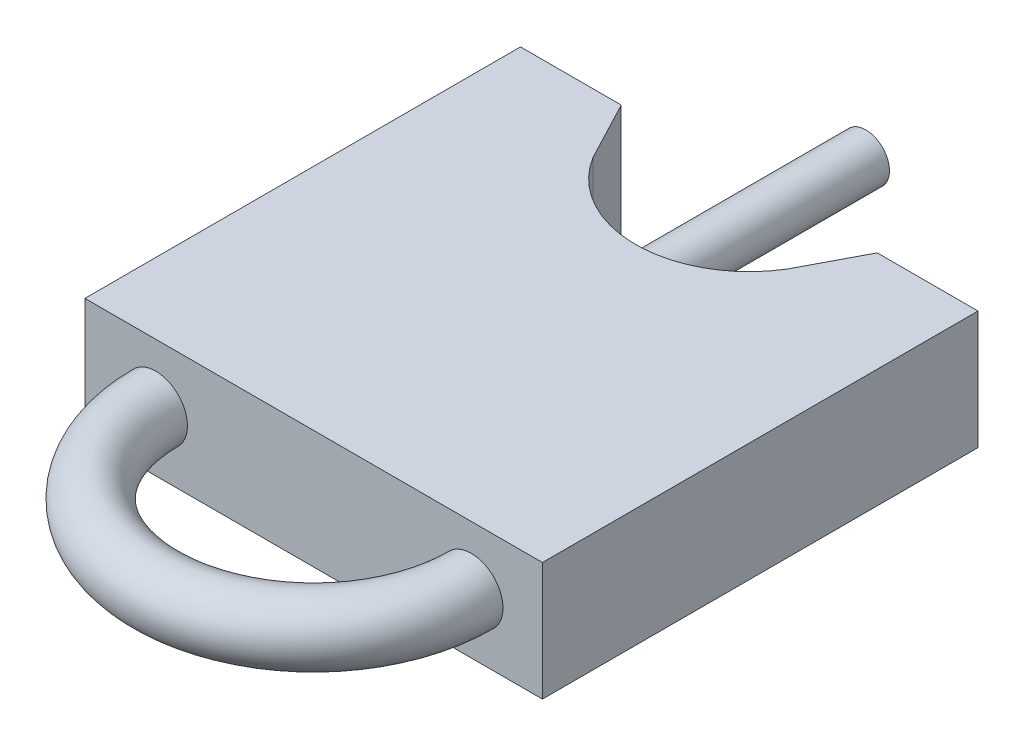
ISO-10303-21;
HEADER;
FILE_DESCRIPTION(('STEP AP214'),'2;1');
FILE_NAME('part.step','',(''),(''),'','','');
FILE_SCHEMA(('AUTOMOTIVE_DESIGN { 1 0 10303 214 1 1 1 1 }'));
ENDSEC;
DATA;
#1=APPLICATION_CONTEXT('core data for automotive mechanical design processes');
#2=APPLICATION_PROTOCOL_DEFINITION('international standard','automotive_design',2000,#1);
#3=PRODUCT_CONTEXT('',#1,'mechanical');
#4=PRODUCT('Part','Part','',(#3));
#5=PRODUCT_RELATED_PRODUCT_CATEGORY('part','',(#4));
#6=PRODUCT_DEFINITION_FORMATION('','',#4);
#7=PRODUCT_DEFINITION_CONTEXT('part definition',#1,'design');
#8=PRODUCT_DEFINITION('design','',#6,#7);
#9=PRODUCT_DEFINITION_SHAPE('','',#8);
#10=(LENGTH_UNIT() NAMED_UNIT(*) SI_UNIT(.MILLI.,.METRE.));
#11=(NAMED_UNIT(*) PLANE_ANGLE_UNIT() SI_UNIT($,.RADIAN.));
#12=(NAMED_UNIT(*) SI_UNIT($,.STERADIAN.) SOLID_ANGLE_UNIT());
#13=UNCERTAINTY_MEASURE_WITH_UNIT(LENGTH_MEASURE(1.E-05),#10,'distance_accuracy_value','');
#14=(GEOMETRIC_REPRESENTATION_CONTEXT(3) GLOBAL_UNCERTAINTY_ASSIGNED_CONTEXT((#13)) GLOBAL_UNIT_ASSIGNED_CONTEXT((#10,
#11,#12)) REPRESENTATION_CONTEXT('',''));
#15=CARTESIAN_POINT('',(0.,0.,0.));
#16=DIRECTION('',(0.,0.,1.));
#17=DIRECTION('',(1.,0.,0.));
#18=AXIS2_PLACEMENT_3D('',#15,#16,#17);
#19=CARTESIAN_POINT('',(14.5,0.,15.));
#20=DIRECTION('',(-1.,0.,0.));
#21=DIRECTION('',(0.,-1.,0.));
#22=AXIS2_PLACEMENT_3D('',#19,#20,#21);
#23=PLANE('',#22);
#24=DIRECTION('',(0.,0.,-1.));
#25=VECTOR('',#24,1.);
#26=CARTESIAN_POINT('',(14.5,-5.,15.));
#27=LINE('',#26,#25);
#28=CARTESIAN_POINT('',(14.5,-5.,15.));
#29=VERTEX_POINT('',#28);
#30=CARTESIAN_POINT('',(14.5,-5.,-12.61));
#31=VERTEX_POINT('',#30);
#32=EDGE_CURVE('E169',#29,#31,#27,.T.);
#33=ORIENTED_EDGE('',*,*,#32,.T.);
#34=DIRECTION('',(0.,1.,0.));
#35=VECTOR('',#34,1.);
#36=CARTESIAN_POINT('',(14.5,-36.6229679189035,-12.61));
#37=LINE('',#36,#35);
#38=CARTESIAN_POINT('',(14.5,2.5,-12.61));
#39=VERTEX_POINT('',#38);
#40=EDGE_CURVE('E143',#31,#39,#37,.T.);
#41=ORIENTED_EDGE('',*,*,#40,.T.);
#42=DIRECTION('',(0.,0.,-1.));
#43=VECTOR('',#42,1.);
#44=CARTESIAN_POINT('',(14.5,2.5,15.));
#45=LINE('',#44,#43);
#46=CARTESIAN_POINT('',(14.5,2.5,15.));
#47=VERTEX_POINT('',#46);
#48=EDGE_CURVE('E136',#47,#39,#45,.T.);
#49=ORIENTED_EDGE('',*,*,#48,.F.);
#50=DIRECTION('',(0.,1.,0.));
#51=VECTOR('',#50,1.);
#52=CARTESIAN_POINT('',(14.5,0.,15.));
#53=LINE('',#52,#51);
#54=EDGE_CURVE('E161',#29,#47,#53,.T.);
#55=ORIENTED_EDGE('',*,*,#54,.F.);
#56=EDGE_LOOP('',(#33,#41,#49,#55));
#57=FACE_BOUND('',#56,.T.);
#58=ADVANCED_FACE('F60',(#57),#23,.F.);
#59=CARTESIAN_POINT('',(0.,2.5,15.));
#60=DIRECTION('',(0.,1.,0.));
#61=DIRECTION('',(-1.,0.,0.));
#62=AXIS2_PLACEMENT_3D('',#59,#60,#61);
#63=PLANE('',#62);
#64=DIRECTION('',(1.,0.,0.));
#65=VECTOR('',#64,1.);
#66=CARTESIAN_POINT('',(0.,2.5,-12.61));
#67=LINE('',#66,#65);
#68=CARTESIAN_POINT('',(8.11481498177935,2.5,-12.61));
#69=VERTEX_POINT('',#68);
#70=EDGE_CURVE('E144',#69,#39,#67,.T.);
#71=ORIENTED_EDGE('',*,*,#70,.F.);
#72=DIRECTION('',(0.465219407707572,0.,-0.885195403677751));
#73=VECTOR('',#72,1.);
#74=CARTESIAN_POINT('',(-5.01154344712309,2.5,12.3661552415605));
#75=LINE('',#74,#73);
#76=CARTESIAN_POINT('',(6.12982564685899,2.5,-8.83306506024928));
#77=VERTEX_POINT('',#76);
#78=EDGE_CURVE('E241',#69,#77,#75,.F.);
#79=ORIENTED_EDGE('',*,*,#78,.T.);
#80=CARTESIAN_POINT('',(0.,2.5,-12.61));
#81=DIRECTION('',(0.,1.,0.));
#82=DIRECTION('',(-1.,0.,0.));
#83=AXIS2_PLACEMENT_3D('',#80,#81,#82);
#84=CIRCLE('',#83,7.2);
#85=CARTESIAN_POINT('',(-6.12982564685899,2.5,-8.83306506024929));
#86=VERTEX_POINT('',#85);
#87=EDGE_CURVE('E150',#86,#77,#84,.T.);
#88=ORIENTED_EDGE('',*,*,#87,.F.);
#89=DIRECTION('',(0.465219407707571,0.,0.885195403677751));
#90=VECTOR('',#89,1.);
#91=CARTESIAN_POINT('',(5.01154344712308,2.5,12.3661552415605));
#92=LINE('',#91,#90);
#93=CARTESIAN_POINT('',(-8.11481498177935,2.5,-12.61));
#94=VERTEX_POINT('',#93);
#95=EDGE_CURVE('E149',#86,#94,#92,.F.);
#96=ORIENTED_EDGE('',*,*,#95,.T.);
#97=DIRECTION('',(1.,0.,0.));
#98=VECTOR('',#97,1.);
#99=CARTESIAN_POINT('',(0.,2.5,-12.61));
#100=LINE('',#99,#98);
#101=CARTESIAN_POINT('',(-14.5,2.5,-12.61));
#102=VERTEX_POINT('',#101);
#103=EDGE_CURVE('E140',#102,#94,#100,.T.);
#104=ORIENTED_EDGE('',*,*,#103,.F.);
#105=DIRECTION('',(0.,0.,-1.));
#106=VECTOR('',#105,1.);
#107=CARTESIAN_POINT('',(-14.5,2.5,15.));
#108=LINE('',#107,#106);
#109=CARTESIAN_POINT('',(-14.5,2.5,15.));
#110=VERTEX_POINT('',#109);
#111=EDGE_CURVE('E126',#110,#102,#108,.T.);
#112=ORIENTED_EDGE('',*,*,#111,.F.);
#113=DIRECTION('',(1.,0.,0.));
#114=VECTOR('',#113,1.);
#115=CARTESIAN_POINT('',(0.,2.5,15.));
#116=LINE('',#115,#114);
#117=EDGE_CURVE('E163',#110,#47,#116,.T.);
#118=ORIENTED_EDGE('',*,*,#117,.T.);
#119=ORIENTED_EDGE('',*,*,#48,.T.);
#120=EDGE_LOOP('',(#71,#79,#88,#96,#104,#112,#118,#119));
#121=FACE_BOUND('',#120,.T.);
#122=ADVANCED_FACE('F147',(#121),#63,.T.);
#123=CARTESIAN_POINT('',(-14.5,0.,15.));
#124=DIRECTION('',(-1.,0.,0.));
#125=DIRECTION('',(0.,0.,1.));
#126=AXIS2_PLACEMENT_3D('',#123,#124,#125);
#127=PLANE('',#126);
#128=ORIENTED_EDGE('',*,*,#111,.T.);
#129=DIRECTION('',(0.,1.,0.));
#130=VECTOR('',#129,1.);
#131=CARTESIAN_POINT('',(-14.5,-36.6229679189035,-12.61));
#132=LINE('',#131,#130);
#133=CARTESIAN_POINT('',(-14.5,-5.,-12.61));
#134=VERTEX_POINT('',#133);
#135=EDGE_CURVE('E129',#134,#102,#132,.T.);
#136=ORIENTED_EDGE('',*,*,#135,.F.);
#137=DIRECTION('',(0.,0.,-1.));
#138=VECTOR('',#137,1.);
#139=CARTESIAN_POINT('',(-14.5,-5.,15.));
#140=LINE('',#139,#138);
#141=CARTESIAN_POINT('',(-14.5,-5.,15.));
#142=VERTEX_POINT('',#141);
#143=EDGE_CURVE('E137',#142,#134,#140,.T.);
#144=ORIENTED_EDGE('',*,*,#143,.F.);
#145=DIRECTION('',(0.,1.,0.));
#146=VECTOR('',#145,1.);
#147=CARTESIAN_POINT('',(-14.5,0.,15.));
#148=LINE('',#147,#146);
#149=EDGE_CURVE('E131',#142,#110,#148,.T.);
#150=ORIENTED_EDGE('',*,*,#149,.T.);
#151=EDGE_LOOP('',(#128,#136,#144,#150));
#152=FACE_BOUND('',#151,.T.);
#153=ADVANCED_FACE('F128',(#152),#127,.T.);
#154=CARTESIAN_POINT('',(0.,-5.,15.));
#155=DIRECTION('',(0.,1.,0.));
#156=DIRECTION('',(-1.,0.,0.));
#157=AXIS2_PLACEMENT_3D('',#154,#155,#156);
#158=PLANE('',#157);
#159=CARTESIAN_POINT('',(0.,-5.,-12.61));
#160=DIRECTION('',(0.,1.,0.));
#161=DIRECTION('',(-1.,0.,0.));
#162=AXIS2_PLACEMENT_3D('',#159,#160,#161);
#163=CIRCLE('',#162,7.2);
#164=CARTESIAN_POINT('',(6.12982564685899,-5.,-8.83306506024928));
#165=VERTEX_POINT('',#164);
#166=CARTESIAN_POINT('',(-6.12982564685899,-5.,-8.83306506024929));
#167=VERTEX_POINT('',#166);
#168=EDGE_CURVE('E191',#165,#167,#163,.F.);
#169=ORIENTED_EDGE('',*,*,#168,.F.);
#170=DIRECTION('',(-0.465219407707572,0.,0.885195403677751));
#171=VECTOR('',#170,1.);
#172=CARTESIAN_POINT('',(8.11481498177936,-5.,-12.61));
#173=LINE('',#172,#171);
#174=CARTESIAN_POINT('',(8.11481498177935,-5.,-12.61));
#175=VERTEX_POINT('',#174);
#176=EDGE_CURVE('E69',#165,#175,#173,.F.);
#177=ORIENTED_EDGE('',*,*,#176,.T.);
#178=DIRECTION('',(-1.,0.,0.));
#179=VECTOR('',#178,1.);
#180=CARTESIAN_POINT('',(0.,-5.,-12.61));
#181=LINE('',#180,#179);
#182=EDGE_CURVE('E160',#31,#175,#181,.T.);
#183=ORIENTED_EDGE('',*,*,#182,.F.);
#184=ORIENTED_EDGE('',*,*,#32,.F.);
#185=DIRECTION('',(1.,0.,0.));
#186=VECTOR('',#185,1.);
#187=CARTESIAN_POINT('',(0.,-5.,15.));
#188=LINE('',#187,#186);
#189=EDGE_CURVE('E167',#142,#29,#188,.T.);
#190=ORIENTED_EDGE('',*,*,#189,.F.);
#191=ORIENTED_EDGE('',*,*,#143,.T.);
#192=DIRECTION('',(-1.,0.,0.));
#193=VECTOR('',#192,1.);
#194=CARTESIAN_POINT('',(0.,-5.,-12.61));
#195=LINE('',#194,#193);
#196=CARTESIAN_POINT('',(-8.11481498177935,-5.,-12.61));
#197=VERTEX_POINT('',#196);
#198=EDGE_CURVE('E141',#197,#134,#195,.T.);
#199=ORIENTED_EDGE('',*,*,#198,.F.);
#200=DIRECTION('',(-0.465219407707571,0.,-0.885195403677751));
#201=VECTOR('',#200,1.);
#202=CARTESIAN_POINT('',(-6.12982564685899,-5.,-8.83306506024928));
#203=LINE('',#202,#201);
#204=EDGE_CURVE('E81',#197,#167,#203,.F.);
#205=ORIENTED_EDGE('',*,*,#204,.T.);
#206=EDGE_LOOP('',(#169,#177,#183,#184,#190,#191,#199,#205));
#207=FACE_BOUND('',#206,.T.);
#208=ADVANCED_FACE('F212',(#207),#158,.F.);
#209=CARTESIAN_POINT('',(0.,0.,15.));
#210=DIRECTION('',(0.,0.,1.));
#211=DIRECTION('',(1.,0.,0.));
#212=AXIS2_PLACEMENT_3D('',#209,#210,#211);
#213=PLANE('',#212);
#214=CARTESIAN_POINT('',(10.,-1.25,15.));
#215=DIRECTION('',(0.,0.,1.));
#216=DIRECTION('',(1.,0.,0.));
#217=AXIS2_PLACEMENT_3D('',#214,#215,#216);
#218=CIRCLE('',#217,2.);
#219=CARTESIAN_POINT('',(12.,-1.25,15.));
#220=VERTEX_POINT('',#219);
#221=EDGE_CURVE('E180',#220,#220,#218,.T.);
#222=ORIENTED_EDGE('',*,*,#221,.F.);
#223=EDGE_LOOP('',(#222));
#224=FACE_BOUND('',#223,.T.);
#225=CARTESIAN_POINT('',(-10.,-1.25,15.));
#226=DIRECTION('',(0.,0.,1.));
#227=DIRECTION('',(1.,0.,0.));
#228=AXIS2_PLACEMENT_3D('',#225,#226,#227);
#229=CIRCLE('',#228,2.);
#230=CARTESIAN_POINT('',(-12.,-1.25,15.));
#231=VERTEX_POINT('',#230);
#232=EDGE_CURVE('E177',#231,#231,#229,.T.);
#233=ORIENTED_EDGE('',*,*,#232,.F.);
#234=EDGE_LOOP('',(#233));
#235=FACE_BOUND('',#234,.T.);
#236=ORIENTED_EDGE('',*,*,#54,.T.);
#237=ORIENTED_EDGE('',*,*,#117,.F.);
#238=ORIENTED_EDGE('',*,*,#149,.F.);
#239=ORIENTED_EDGE('',*,*,#189,.T.);
#240=EDGE_LOOP('',(#236,#237,#238,#239));
#241=FACE_BOUND('',#240,.T.);
#242=ADVANCED_FACE('F208',(#224,#235,#241),#213,.T.);
#243=CARTESIAN_POINT('',(0.,-1.25,15.));
#244=DIRECTION('',(0.,1.,0.));
#245=DIRECTION('',(-1.,0.,0.));
#246=AXIS2_PLACEMENT_3D('',#243,#244,#245);
#247=TOROIDAL_SURFACE('',#246,10.,2.);
#248=CARTESIAN_POINT('',(0.,-1.25,15.));
#249=DIRECTION('',(0.,1.,0.));
#250=DIRECTION('',(-1.,0.,0.));
#251=AXIS2_PLACEMENT_3D('',#248,#249,#250);
#252=CIRCLE('',#251,12.);
#253=EDGE_CURVE('',#231,#220,#252,.T.);
#254=ORIENTED_EDGE('',*,*,#232,.T.);
#255=ORIENTED_EDGE('',*,*,#221,.T.);
#256=ORIENTED_EDGE('',*,*,#253,.T.);
#257=ORIENTED_EDGE('',*,*,#253,.F.);
#258=EDGE_LOOP('',(#254,#256,#255,#257));
#259=FACE_BOUND('',#258,.T.);
#260=ADVANCED_FACE('F205',(#259),#247,.T.);
#261=CARTESIAN_POINT('',(0.,-36.6229679189035,-12.61));
#262=DIRECTION('',(0.,0.,1.));
#263=DIRECTION('',(1.,0.,0.));
#264=AXIS2_PLACEMENT_3D('',#261,#262,#263);
#265=PLANE('',#264);
#266=ORIENTED_EDGE('',*,*,#103,.T.);
#267=DIRECTION('',(0.,-1.,0.));
#268=VECTOR('',#267,1.);
#269=CARTESIAN_POINT('',(-8.11481498177935,-36.6229679189035,-12.61));
#270=LINE('',#269,#268);
#271=EDGE_CURVE('E12',#94,#197,#270,.T.);
#272=ORIENTED_EDGE('',*,*,#271,.T.);
#273=ORIENTED_EDGE('',*,*,#198,.T.);
#274=ORIENTED_EDGE('',*,*,#135,.T.);
#275=EDGE_LOOP('',(#266,#272,#273,#274));
#276=FACE_BOUND('',#275,.T.);
#277=ADVANCED_FACE('F139',(#276),#265,.F.);
#278=CARTESIAN_POINT('',(0.,-36.6229679189035,-12.61));
#279=DIRECTION('',(0.,0.,1.));
#280=DIRECTION('',(1.,0.,0.));
#281=AXIS2_PLACEMENT_3D('',#278,#279,#280);
#282=PLANE('',#281);
#283=ORIENTED_EDGE('',*,*,#182,.T.);
#284=DIRECTION('',(0.,1.,0.));
#285=VECTOR('',#284,1.);
#286=CARTESIAN_POINT('',(8.11481498177935,-36.6229679189035,-12.61));
#287=LINE('',#286,#285);
#288=EDGE_CURVE('E183',#175,#69,#287,.T.);
#289=ORIENTED_EDGE('',*,*,#288,.T.);
#290=ORIENTED_EDGE('',*,*,#70,.T.);
#291=ORIENTED_EDGE('',*,*,#40,.F.);
#292=EDGE_LOOP('',(#283,#289,#290,#291));
#293=FACE_BOUND('',#292,.T.);
#294=ADVANCED_FACE('F202',(#293),#282,.F.);
#295=CARTESIAN_POINT('',(0.,-36.6229679189035,-12.61));
#296=DIRECTION('',(0.,1.,0.));
#297=DIRECTION('',(-1.,0.,0.));
#298=AXIS2_PLACEMENT_3D('',#295,#296,#297);
#299=CYLINDRICAL_SURFACE('',#298,7.2);
#300=CARTESIAN_POINT('',(1.5,0.,-5.5679832434167));
#301=CARTESIAN_POINT('',(1.4999970105312,-0.0832687381812369,-5.56798156943626));
#302=CARTESIAN_POINT('',(1.49304275320737,-0.166574366418262,-5.56649024890548));
#303=CARTESIAN_POINT('',(1.46543579080535,-0.330823580780698,-5.56069581301843));
#304=CARTESIAN_POINT('',(1.44477258528411,-0.411765306607708,-5.55639054233934));
#305=CARTESIAN_POINT('',(1.39042077008676,-0.568886847401842,-5.54547648445684));
#306=CARTESIAN_POINT('',(1.35674569498719,-0.645071515190165,-5.53887009151666));
#307=CARTESIAN_POINT('',(1.27736386322079,-0.790709399574722,-5.52410102397111));
#308=CARTESIAN_POINT('',(1.23165759282984,-0.860162888076021,-5.51593841226853));
#309=CARTESIAN_POINT('',(1.1287636793593,-0.991434450184156,-5.49883678406239));
#310=CARTESIAN_POINT('',(1.0714266658436,-1.05313427235176,-5.48988862752353));
#311=CARTESIAN_POINT('',(0.947221468656765,-1.16611328237773,-5.4723043983691));
#312=CARTESIAN_POINT('',(0.880352586547204,-1.21739170594973,-5.46366834868102));
#313=CARTESIAN_POINT('',(0.738194463599507,-1.30853506569943,-5.44758237857382));
#314=CARTESIAN_POINT('',(0.66283131384593,-1.34828703175591,-5.44014449642509));
#315=CARTESIAN_POINT('',(0.506314261208064,-1.41451926343174,-5.42739583188037));
#316=CARTESIAN_POINT('',(0.42516094794071,-1.44100087818424,-5.42208483326533));
#317=CARTESIAN_POINT('',(0.260595485040603,-1.47957091334097,-5.41425292129386));
#318=CARTESIAN_POINT('',(0.177232057099629,-1.4918592206342,-5.41169329648089));
#319=CARTESIAN_POINT('',(0.00959021860742903,-1.50231803490842,-5.40951864903265));
#320=CARTESIAN_POINT('',(-0.0746880956842065,-1.50049001303173,-5.40990331955572));
#321=CARTESIAN_POINT('',(-0.240391903439487,-1.48291847885191,-5.41354410291387));
#322=CARTESIAN_POINT('',(-0.321841354471771,-1.46739033725026,-5.41675577252099));
#323=CARTESIAN_POINT('',(-0.480952495547703,-1.42320164960244,-5.42563934921338));
#324=CARTESIAN_POINT('',(-0.558614025013227,-1.39454054735631,-5.43131136049715));
#325=CARTESIAN_POINT('',(-0.708552006461622,-1.3247039374494,-5.44455079211292));
#326=CARTESIAN_POINT('',(-0.780788561977981,-1.28344524694841,-5.45213075049585));
#327=CARTESIAN_POINT('',(-0.917392147812779,-1.1896463965915,-5.46835239471774));
#328=CARTESIAN_POINT('',(-0.981758198179704,-1.13710483415265,-5.4769942125001));
#329=CARTESIAN_POINT('',(-1.1020730439323,-1.02105405013074,-5.49457959720069));
#330=CARTESIAN_POINT('',(-1.15783978499375,-0.957356328021666,-5.50352578028889));
#331=CARTESIAN_POINT('',(-1.25793116688586,-0.821421541206241,-5.52055752821205));
#332=CARTESIAN_POINT('',(-1.30225555283976,-0.74918428633532,-5.52864307387408));
#333=CARTESIAN_POINT('',(-1.37827460566145,-0.597945294205443,-5.54304401909013));
#334=CARTESIAN_POINT('',(-1.40993766587673,-0.518927219167881,-5.5493549772145));
#335=CARTESIAN_POINT('',(-1.45948293046407,-0.356530056756738,-5.55942872307568));
#336=CARTESIAN_POINT('',(-1.47736709858818,-0.273151592630289,-5.56319187391381));
#337=CARTESIAN_POINT('',(-1.49857036640421,-0.106056352417313,-5.56767060113042));
#338=CARTESIAN_POINT('',(-1.50215331501598,-0.0223744985555643,-5.56844137763831));
#339=CARTESIAN_POINT('',(-1.49536432127153,0.144390973848169,-5.56699657577556));
#340=CARTESIAN_POINT('',(-1.48499324229435,0.227474629082801,-5.56478118216852));
#341=CARTESIAN_POINT('',(-1.45081869990581,0.389784619269748,-5.55766554128601));
#342=CARTESIAN_POINT('',(-1.42715809652246,0.469042400614594,-5.55279386460403));
#343=CARTESIAN_POINT('',(-1.36722973033103,0.622468787329923,-5.54093993796256));
#344=CARTESIAN_POINT('',(-1.33096085467376,0.696636942780482,-5.53395750170731));
#345=CARTESIAN_POINT('',(-1.24625517817782,0.838927729459475,-5.51854597675371));
#346=CARTESIAN_POINT('',(-1.19765439282476,0.906950645359403,-5.51009792022012));
#347=CARTESIAN_POINT('',(-1.08988132868386,1.03397189898607,-5.49275819207311));
#348=CARTESIAN_POINT('',(-1.03070786460621,1.09296922348708,-5.48386647080162));
#349=CARTESIAN_POINT('',(-0.902280541012008,1.2012752557166,-5.46646090819916));
#350=CARTESIAN_POINT('',(-0.832874289137463,1.25040491403166,-5.45795590336108));
#351=CARTESIAN_POINT('',(-0.686640122659632,1.33630650250558,-5.44243949473112));
#352=CARTESIAN_POINT('',(-0.609812536172258,1.37307897868494,-5.43542802495018));
#353=CARTESIAN_POINT('',(-0.451370541417504,1.43296641518082,-5.42372622075186));
#354=CARTESIAN_POINT('',(-0.369788053164234,1.45616299865321,-5.41902204236204));
#355=CARTESIAN_POINT('',(-0.203776080604167,1.48849728480972,-5.41240526307728));
#356=CARTESIAN_POINT('',(-0.119346971354035,1.49763683223928,-5.41049229588534));
#357=CARTESIAN_POINT('',(0.0482560121644068,1.50152114645822,-5.40968310331671));
#358=CARTESIAN_POINT('',(0.131423510613506,1.49653427999368,-5.41073063494227));
#359=CARTESIAN_POINT('',(0.295707444448263,1.47290323361648,-5.41560551086633));
#360=CARTESIAN_POINT('',(0.376823910243243,1.45425925631188,-5.41943281392593));
#361=CARTESIAN_POINT('',(0.534518358590463,1.40396664642173,-5.42943447906948));
#362=CARTESIAN_POINT('',(0.611107860005429,1.37235280337627,-5.43560255910933));
#363=CARTESIAN_POINT('',(0.757932680664891,1.2970531227216,-5.44962405582755));
#364=CARTESIAN_POINT('',(0.828167445935414,1.25336623398824,-5.45747761923705));
#365=CARTESIAN_POINT('',(0.961608385557914,1.15426839840803,-5.47418083856337));
#366=CARTESIAN_POINT('',(1.02467116033911,1.09866685433196,-5.48304543636579));
#367=CARTESIAN_POINT('',(1.14066329037646,0.977706598803499,-5.5006865582638));
#368=CARTESIAN_POINT('',(1.19359022588548,0.912345564061881,-5.50946306085558));
#369=CARTESIAN_POINT('',(1.28840942223321,0.772789077079873,-5.52604970028008));
#370=CARTESIAN_POINT('',(1.33016313752393,0.698497906245485,-5.53384711956939));
#371=CARTESIAN_POINT('',(1.40052753510368,0.543809812700081,-5.54743552410325));
#372=CARTESIAN_POINT('',(1.42914979550952,0.463418341856389,-5.55322827576879));
#373=CARTESIAN_POINT('',(1.46707864958233,0.319072462117877,-5.56103194713765));
#374=CARTESIAN_POINT('',(1.47940138806804,0.255924556088334,-5.56362203690094));
#375=CARTESIAN_POINT('',(1.49586305230085,0.128525063374787,-5.56709829679867));
#376=CARTESIAN_POINT('',(1.50000230751289,0.0642735212279467,-5.56798453552968));
#377=CARTESIAN_POINT('',(1.5,0.,-5.5679832434167));
#378=B_SPLINE_CURVE_WITH_KNOTS('',3,(#300,#301,#302,#303,#304,#305,#306,#307,#308,#309,#310,
#311,#312,#313,#314,#315,#316,#317,#318,#319,#320,#321,#322,#323,#324,#325,#326,#327,#328,#329,
#330,#331,#332,#333,#334,#335,#336,#337,#338,#339,#340,#341,#342,#343,#344,#345,#346,#347,#348,
#349,#350,#351,#352,#353,#354,#355,#356,#357,#358,#359,#360,#361,#362,#363,#364,#365,#366,#367,
#368,#369,#370,#371,#372,#373,#374,#375,#376,#377),.UNSPECIFIED.,.T.,.F.,(4,2,2,2,2,2,2,2,2,2,2,
2,2,2,2,2,2,2,2,2,2,2,2,2,2,2,2,2,2,2,2,2,2,2,2,2,2,2,4),(0.,0.249570784885524,
0.499332950900965,0.748836017763276,0.998329001778949,1.25125600161462,1.50420154396649,
1.75954831520213,2.0148691212832,2.26654858631117,2.51820182275607,2.76596809699754,
3.01374486547045,3.26319446373539,3.51267508925112,3.76687034693896,4.02107126629954,
4.27590284798986,4.53069810465117,4.78077019211751,5.03082680755829,5.27824543478308,
5.52568590556837,5.77660701521582,6.02755627298623,6.28271350504013,6.53785946110849,
6.79145519578242,7.04501764751498,7.29379552707174,7.54256971599578,7.79068092702121,
8.03881374633809,8.29125982774289,8.54376610113043,8.79927181629748,9.05455181486387,
9.24719841102924,9.43983725113394),.UNSPECIFIED.);
#379=CARTESIAN_POINT('',(1.5,0.,-5.5679832434167));
#380=VERTEX_POINT('',#379);
#381=EDGE_CURVE('E164',#380,#380,#378,.T.);
#382=ORIENTED_EDGE('',*,*,#381,.F.);
#383=EDGE_LOOP('',(#382));
#384=FACE_BOUND('',#383,.T.);
#385=ORIENTED_EDGE('',*,*,#87,.T.);
#386=DIRECTION('',(0.,1.,0.));
#387=VECTOR('',#386,1.);
#388=CARTESIAN_POINT('',(6.12982564685899,-36.6229679189035,-8.83306506024928));
#389=LINE('',#388,#387);
#390=EDGE_CURVE('E235',#77,#165,#389,.F.);
#391=ORIENTED_EDGE('',*,*,#390,.T.);
#392=ORIENTED_EDGE('',*,*,#168,.T.);
#393=DIRECTION('',(0.,1.,0.));
#394=VECTOR('',#393,1.);
#395=CARTESIAN_POINT('',(-6.12982564685899,-36.6229679189035,-8.83306506024929));
#396=LINE('',#395,#394);
#397=EDGE_CURVE('E237',#167,#86,#396,.T.);
#398=ORIENTED_EDGE('',*,*,#397,.T.);
#399=EDGE_LOOP('',(#385,#391,#392,#398));
#400=FACE_BOUND('',#399,.T.);
#401=ADVANCED_FACE('F196',(#384,#400),#299,.F.);
#402=CARTESIAN_POINT('',(0.,0.,-20.));
#403=DIRECTION('',(0.,0.,1.));
#404=DIRECTION('',(1.,0.,0.));
#405=AXIS2_PLACEMENT_3D('',#402,#403,#404);
#406=PLANE('',#405);
#407=CARTESIAN_POINT('',(0.,0.,-20.));
#408=DIRECTION('',(0.,0.,1.));
#409=DIRECTION('',(1.,0.,0.));
#410=AXIS2_PLACEMENT_3D('',#407,#408,#409);
#411=CIRCLE('',#410,1.5);
#412=CARTESIAN_POINT('',(1.5,0.,-20.));
#413=VERTEX_POINT('',#412);
#414=EDGE_CURVE('E174',#413,#413,#411,.T.);
#415=ORIENTED_EDGE('',*,*,#414,.F.);
#416=EDGE_LOOP('',(#415));
#417=FACE_BOUND('',#416,.T.);
#418=ADVANCED_FACE('F201',(#417),#406,.F.);
#419=CARTESIAN_POINT('',(0.,0.,-20.));
#420=DIRECTION('',(0.,0.,1.));
#421=DIRECTION('',(1.,0.,0.));
#422=AXIS2_PLACEMENT_3D('',#419,#420,#421);
#423=CYLINDRICAL_SURFACE('',#422,1.5);
#424=ORIENTED_EDGE('',*,*,#414,.T.);
#425=EDGE_LOOP('',(#424));
#426=FACE_BOUND('',#425,.T.);
#427=ORIENTED_EDGE('',*,*,#381,.T.);
#428=EDGE_LOOP('',(#427));
#429=FACE_BOUND('',#428,.T.);
#430=ADVANCED_FACE('F193',(#426,#429),#423,.T.);
#431=CARTESIAN_POINT('',(8.11481498177936,-36.6229679189035,-12.61));
#432=DIRECTION('',(0.885195403677751,0.,0.465219407707572));
#433=DIRECTION('',(0.,1.,0.));
#434=AXIS2_PLACEMENT_3D('',#431,#432,#433);
#435=PLANE('',#434);
#436=ORIENTED_EDGE('',*,*,#176,.F.);
#437=ORIENTED_EDGE('',*,*,#390,.F.);
#438=ORIENTED_EDGE('',*,*,#78,.F.);
#439=ORIENTED_EDGE('',*,*,#288,.F.);
#440=EDGE_LOOP('',(#436,#437,#438,#439));
#441=FACE_BOUND('',#440,.T.);
#442=ADVANCED_FACE('F227',(#441),#435,.F.);
#443=CARTESIAN_POINT('',(-6.12982564685898,-36.6229679189035,-8.83306506024928));
#444=DIRECTION('',(-0.885195403677751,0.,0.465219407707571));
#445=DIRECTION('',(0.,1.,0.));
#446=AXIS2_PLACEMENT_3D('',#443,#444,#445);
#447=PLANE('',#446);
#448=ORIENTED_EDGE('',*,*,#204,.F.);
#449=ORIENTED_EDGE('',*,*,#271,.F.);
#450=ORIENTED_EDGE('',*,*,#95,.F.);
#451=ORIENTED_EDGE('',*,*,#397,.F.);
#452=EDGE_LOOP('',(#448,#449,#450,#451));
#453=FACE_BOUND('',#452,.T.);
#454=ADVANCED_FACE('F63',(#453),#447,.F.);
#455=CLOSED_SHELL('',(#58,#122,#153,#208,#242,#260,#277,#294,#401,#418,#430,#442,#454));
#456=MANIFOLD_SOLID_BREP('B2',#455);
#457=ADVANCED_BREP_SHAPE_REPRESENTATION('',(#18,#456),#14);
#458=SHAPE_DEFINITION_REPRESENTATION(#9,#457);
ENDSEC;
END-ISO-10303-21;
